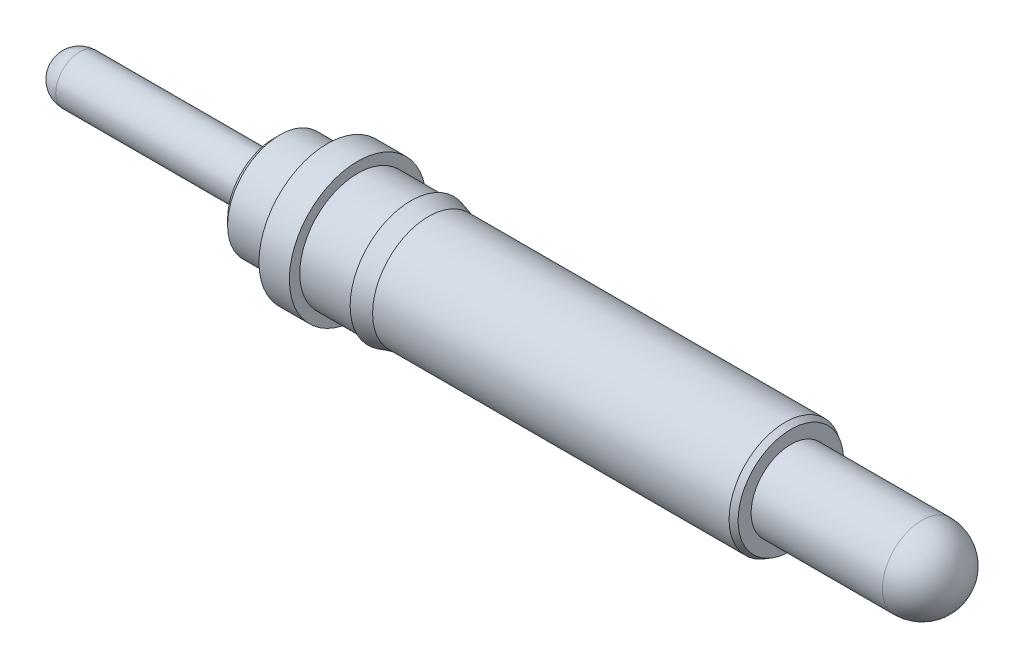
ISO-10303-21;
HEADER;
FILE_DESCRIPTION(('STEP AP214'),'2;1');
FILE_NAME('part.step','',(''),(''),'','','');
FILE_SCHEMA(('AUTOMOTIVE_DESIGN { 1 0 10303 214 1 1 1 1 }'));
ENDSEC;
DATA;
#1=APPLICATION_CONTEXT('core data for automotive mechanical design processes');
#2=APPLICATION_PROTOCOL_DEFINITION('international standard','automotive_design',2000,#1);
#3=PRODUCT_CONTEXT('',#1,'mechanical');
#4=PRODUCT('Part','Part','',(#3));
#5=PRODUCT_RELATED_PRODUCT_CATEGORY('part','',(#4));
#6=PRODUCT_DEFINITION_FORMATION('','',#4);
#7=PRODUCT_DEFINITION_CONTEXT('part definition',#1,'design');
#8=PRODUCT_DEFINITION('design','',#6,#7);
#9=PRODUCT_DEFINITION_SHAPE('','',#8);
#10=(LENGTH_UNIT() NAMED_UNIT(*) SI_UNIT(.MILLI.,.METRE.));
#11=(NAMED_UNIT(*) PLANE_ANGLE_UNIT() SI_UNIT($,.RADIAN.));
#12=(NAMED_UNIT(*) SI_UNIT($,.STERADIAN.) SOLID_ANGLE_UNIT());
#13=UNCERTAINTY_MEASURE_WITH_UNIT(LENGTH_MEASURE(1.E-05),#10,'distance_accuracy_value','');
#14=(GEOMETRIC_REPRESENTATION_CONTEXT(3) GLOBAL_UNCERTAINTY_ASSIGNED_CONTEXT((#13)) GLOBAL_UNIT_ASSIGNED_CONTEXT((#10,
#11,#12)) REPRESENTATION_CONTEXT('',''));
#15=CARTESIAN_POINT('',(0.,0.,0.));
#16=DIRECTION('',(0.,0.,1.));
#17=DIRECTION('',(1.,0.,0.));
#18=AXIS2_PLACEMENT_3D('',#15,#16,#17);
#19=CARTESIAN_POINT('',(0.317499999999853,1.69894480428479E-13,0.));
#20=DIRECTION('',(-1.,0.,0.));
#21=DIRECTION('',(0.,1.,0.));
#22=AXIS2_PLACEMENT_3D('',#19,#20,#21);
#23=SPHERICAL_SURFACE('',#22,0.317499999999853);
#24=CARTESIAN_POINT('',(0.317499999999853,0.,0.));
#25=DIRECTION('',(-1.,0.,0.));
#26=DIRECTION('',(0.,0.,1.));
#27=AXIS2_PLACEMENT_3D('',#24,#25,#26);
#28=CIRCLE('',#27,0.317500000000023);
#29=CARTESIAN_POINT('',(0.317499999999853,0.,0.317500000000023));
#30=VERTEX_POINT('',#29);
#31=EDGE_CURVE('E82',#30,#30,#28,.T.);
#32=ORIENTED_EDGE('',*,*,#31,.T.);
#33=EDGE_LOOP('',(#32));
#34=FACE_BOUND('',#33,.T.);
#35=ADVANCED_FACE('F33',(#34),#23,.T.);
#36=CARTESIAN_POINT('',(11.5849400000002,0.,0.));
#37=DIRECTION('',(-1.,0.,0.));
#38=DIRECTION('',(0.,1.,0.));
#39=AXIS2_PLACEMENT_3D('',#36,#37,#38);
#40=SPHERICAL_SURFACE('',#39,0.530859999999887);
#41=CARTESIAN_POINT('',(11.5849400000002,0.,0.));
#42=DIRECTION('',(-1.,0.,0.));
#43=DIRECTION('',(0.,0.,1.));
#44=AXIS2_PLACEMENT_3D('',#41,#42,#43);
#45=CIRCLE('',#44,0.530859999999887);
#46=CARTESIAN_POINT('',(11.5849400000002,0.,0.530859999999887));
#47=VERTEX_POINT('',#46);
#48=EDGE_CURVE('E10',#47,#47,#45,.T.);
#49=ORIENTED_EDGE('',*,*,#48,.F.);
#50=EDGE_LOOP('',(#49));
#51=FACE_BOUND('',#50,.T.);
#52=ADVANCED_FACE('F166',(#51),#40,.T.);
#53=CARTESIAN_POINT('',(0.,0.,0.));
#54=DIRECTION('',(-1.,0.,0.));
#55=DIRECTION('',(0.,0.,1.));
#56=AXIS2_PLACEMENT_3D('',#53,#54,#55);
#57=CYLINDRICAL_SURFACE('',#56,0.530859999999887);
#58=CARTESIAN_POINT('',(9.8298000000001,0.,0.));
#59=DIRECTION('',(-1.,0.,0.));
#60=DIRECTION('',(0.,0.,1.));
#61=AXIS2_PLACEMENT_3D('',#58,#59,#60);
#62=CIRCLE('',#61,0.530859999999887);
#63=CARTESIAN_POINT('',(9.8298000000001,0.,0.530859999999887));
#64=VERTEX_POINT('',#63);
#65=EDGE_CURVE('E39',#64,#64,#62,.T.);
#66=ORIENTED_EDGE('',*,*,#65,.F.);
#67=EDGE_LOOP('',(#66));
#68=FACE_BOUND('',#67,.T.);
#69=ORIENTED_EDGE('',*,*,#48,.T.);
#70=EDGE_LOOP('',(#69));
#71=FACE_BOUND('',#70,.T.);
#72=ADVANCED_FACE('F161',(#68,#71),#57,.T.);
#73=CARTESIAN_POINT('',(9.8298000000001,0.705305909487751,0.));
#74=DIRECTION('',(-1.,0.,0.));
#75=DIRECTION('',(0.,0.,1.));
#76=AXIS2_PLACEMENT_3D('',#73,#74,#75);
#77=PLANE('',#76);
#78=CARTESIAN_POINT('',(9.8298000000001,0.,0.));
#79=DIRECTION('',(-1.,0.,0.));
#80=DIRECTION('',(0.,0.,1.));
#81=AXIS2_PLACEMENT_3D('',#78,#79,#80);
#82=CIRCLE('',#81,0.705305909487751);
#83=CARTESIAN_POINT('',(9.8298000000001,0.,0.705305909487751));
#84=VERTEX_POINT('',#83);
#85=EDGE_CURVE('E43',#84,#84,#82,.T.);
#86=ORIENTED_EDGE('',*,*,#85,.F.);
#87=EDGE_LOOP('',(#86));
#88=FACE_BOUND('',#87,.T.);
#89=ORIENTED_EDGE('',*,*,#65,.T.);
#90=EDGE_LOOP('',(#89));
#91=FACE_BOUND('',#90,.T.);
#92=ADVANCED_FACE('F156',(#88,#91),#77,.F.);
#93=CARTESIAN_POINT('',(9.8298000000001,0.,0.));
#94=DIRECTION('',(-1.,0.,0.));
#95=DIRECTION('',(0.,0.,1.));
#96=AXIS2_PLACEMENT_3D('',#93,#94,#95);
#97=CONICAL_SURFACE('',#96,0.705305909487751,0.523598775598372);
#98=CARTESIAN_POINT('',(9.75360000000005,0.,0.));
#99=DIRECTION('',(-1.,0.,0.));
#100=DIRECTION('',(0.,0.,1.));
#101=AXIS2_PLACEMENT_3D('',#98,#99,#100);
#102=CIRCLE('',#101,0.749300000000036);
#103=CARTESIAN_POINT('',(9.75360000000005,0.,0.749300000000036));
#104=VERTEX_POINT('',#103);
#105=EDGE_CURVE('E47',#104,#104,#102,.T.);
#106=ORIENTED_EDGE('',*,*,#105,.F.);
#107=EDGE_LOOP('',(#106));
#108=FACE_BOUND('',#107,.T.);
#109=ORIENTED_EDGE('',*,*,#85,.T.);
#110=EDGE_LOOP('',(#109));
#111=FACE_BOUND('',#110,.T.);
#112=ADVANCED_FACE('F150',(#108,#111),#97,.T.);
#113=CARTESIAN_POINT('',(0.,0.,0.));
#114=DIRECTION('',(-1.,0.,0.));
#115=DIRECTION('',(0.,0.,1.));
#116=AXIS2_PLACEMENT_3D('',#113,#114,#115);
#117=CYLINDRICAL_SURFACE('',#116,0.749300000000036);
#118=CARTESIAN_POINT('',(4.98678522628056,0.,0.));
#119=DIRECTION('',(-1.,0.,0.));
#120=DIRECTION('',(0.,0.,1.));
#121=AXIS2_PLACEMENT_3D('',#118,#119,#120);
#122=CIRCLE('',#121,0.749300000000036);
#123=CARTESIAN_POINT('',(4.98678522628056,0.,0.749300000000036));
#124=VERTEX_POINT('',#123);
#125=EDGE_CURVE('E52',#124,#124,#122,.T.);
#126=ORIENTED_EDGE('',*,*,#125,.F.);
#127=EDGE_LOOP('',(#126));
#128=FACE_BOUND('',#127,.T.);
#129=ORIENTED_EDGE('',*,*,#105,.T.);
#130=EDGE_LOOP('',(#129));
#131=FACE_BOUND('',#130,.T.);
#132=ADVANCED_FACE('F144',(#128,#131),#117,.T.);
#133=CARTESIAN_POINT('',(4.98678522628056,0.,0.));
#134=DIRECTION('',(-1.,0.,0.));
#135=DIRECTION('',(0.,0.,1.));
#136=AXIS2_PLACEMENT_3D('',#133,#134,#135);
#137=CONICAL_SURFACE('',#136,0.749300000000036,0.261799387799377);
#138=CARTESIAN_POINT('',(4.74980000000002,0.,0.));
#139=DIRECTION('',(-1.,0.,0.));
#140=DIRECTION('',(0.,0.,1.));
#141=AXIS2_PLACEMENT_3D('',#138,#139,#140);
#142=CIRCLE('',#141,0.812800000000071);
#143=CARTESIAN_POINT('',(4.74980000000002,0.,0.812800000000071));
#144=VERTEX_POINT('',#143);
#145=EDGE_CURVE('E55',#144,#144,#142,.T.);
#146=ORIENTED_EDGE('',*,*,#145,.F.);
#147=EDGE_LOOP('',(#146));
#148=FACE_BOUND('',#147,.T.);
#149=ORIENTED_EDGE('',*,*,#125,.T.);
#150=EDGE_LOOP('',(#149));
#151=FACE_BOUND('',#150,.T.);
#152=ADVANCED_FACE('F138',(#148,#151),#137,.T.);
#153=CARTESIAN_POINT('',(4.74980000000002,0.774700000000045,0.));
#154=DIRECTION('',(1.,0.,0.));
#155=DIRECTION('',(0.,0.,-1.));
#156=AXIS2_PLACEMENT_3D('',#153,#154,#155);
#157=PLANE('',#156);
#158=CARTESIAN_POINT('',(4.74980000000002,0.,0.));
#159=DIRECTION('',(-1.,0.,0.));
#160=DIRECTION('',(0.,0.,1.));
#161=AXIS2_PLACEMENT_3D('',#158,#159,#160);
#162=CIRCLE('',#161,0.774700000000045);
#163=CARTESIAN_POINT('',(4.74980000000002,0.,0.774700000000045));
#164=VERTEX_POINT('',#163);
#165=EDGE_CURVE('E58',#164,#164,#162,.T.);
#166=ORIENTED_EDGE('',*,*,#165,.F.);
#167=EDGE_LOOP('',(#166));
#168=FACE_BOUND('',#167,.T.);
#169=ORIENTED_EDGE('',*,*,#145,.T.);
#170=EDGE_LOOP('',(#169));
#171=FACE_BOUND('',#170,.T.);
#172=ADVANCED_FACE('F132',(#168,#171),#157,.F.);
#173=CARTESIAN_POINT('',(0.,0.,0.));
#174=DIRECTION('',(-1.,0.,0.));
#175=DIRECTION('',(0.,0.,1.));
#176=AXIS2_PLACEMENT_3D('',#173,#174,#175);
#177=CYLINDRICAL_SURFACE('',#176,0.774700000000045);
#178=CARTESIAN_POINT('',(4.03860000000005,0.,0.));
#179=DIRECTION('',(-1.,0.,0.));
#180=DIRECTION('',(0.,0.,1.));
#181=AXIS2_PLACEMENT_3D('',#178,#179,#180);
#182=CIRCLE('',#181,0.774700000000045);
#183=CARTESIAN_POINT('',(4.03860000000005,0.,0.774700000000045));
#184=VERTEX_POINT('',#183);
#185=EDGE_CURVE('E61',#184,#184,#182,.T.);
#186=ORIENTED_EDGE('',*,*,#185,.F.);
#187=EDGE_LOOP('',(#186));
#188=FACE_BOUND('',#187,.T.);
#189=ORIENTED_EDGE('',*,*,#165,.T.);
#190=EDGE_LOOP('',(#189));
#191=FACE_BOUND('',#190,.T.);
#192=ADVANCED_FACE('F126',(#188,#191),#177,.T.);
#193=CARTESIAN_POINT('',(4.03860000000005,0.914400000000037,0.));
#194=DIRECTION('',(-1.,0.,0.));
#195=DIRECTION('',(0.,0.,1.));
#196=AXIS2_PLACEMENT_3D('',#193,#194,#195);
#197=PLANE('',#196);
#198=CARTESIAN_POINT('',(4.03860000000005,0.,0.));
#199=DIRECTION('',(-1.,0.,0.));
#200=DIRECTION('',(0.,0.,1.));
#201=AXIS2_PLACEMENT_3D('',#198,#199,#200);
#202=CIRCLE('',#201,0.914400000000037);
#203=CARTESIAN_POINT('',(4.03860000000005,0.,0.914400000000037));
#204=VERTEX_POINT('',#203);
#205=EDGE_CURVE('E64',#204,#204,#202,.T.);
#206=ORIENTED_EDGE('',*,*,#205,.F.);
#207=EDGE_LOOP('',(#206));
#208=FACE_BOUND('',#207,.T.);
#209=ORIENTED_EDGE('',*,*,#185,.T.);
#210=EDGE_LOOP('',(#209));
#211=FACE_BOUND('',#210,.T.);
#212=ADVANCED_FACE('F120',(#208,#211),#197,.F.);
#213=CARTESIAN_POINT('',(0.,0.,0.));
#214=DIRECTION('',(-1.,0.,0.));
#215=DIRECTION('',(0.,0.,1.));
#216=AXIS2_PLACEMENT_3D('',#213,#214,#215);
#217=CYLINDRICAL_SURFACE('',#216,0.914400000000037);
#218=CARTESIAN_POINT('',(3.63220000000005,0.,0.));
#219=DIRECTION('',(-1.,0.,0.));
#220=DIRECTION('',(0.,0.,1.));
#221=AXIS2_PLACEMENT_3D('',#218,#219,#220);
#222=CIRCLE('',#221,0.914400000000037);
#223=CARTESIAN_POINT('',(3.63220000000005,0.,0.914400000000037));
#224=VERTEX_POINT('',#223);
#225=EDGE_CURVE('E67',#224,#224,#222,.T.);
#226=ORIENTED_EDGE('',*,*,#225,.F.);
#227=EDGE_LOOP('',(#226));
#228=FACE_BOUND('',#227,.T.);
#229=ORIENTED_EDGE('',*,*,#205,.T.);
#230=EDGE_LOOP('',(#229));
#231=FACE_BOUND('',#230,.T.);
#232=ADVANCED_FACE('F114',(#228,#231),#217,.T.);
#233=CARTESIAN_POINT('',(3.63220000000005,0.698499999999853,0.));
#234=DIRECTION('',(1.,0.,0.));
#235=DIRECTION('',(0.,0.,-1.));
#236=AXIS2_PLACEMENT_3D('',#233,#234,#235);
#237=PLANE('',#236);
#238=CARTESIAN_POINT('',(3.63220000000005,0.,0.));
#239=DIRECTION('',(-1.,0.,0.));
#240=DIRECTION('',(0.,0.,1.));
#241=AXIS2_PLACEMENT_3D('',#238,#239,#240);
#242=CIRCLE('',#241,0.698499999999853);
#243=CARTESIAN_POINT('',(3.63220000000005,0.,0.698499999999853));
#244=VERTEX_POINT('',#243);
#245=EDGE_CURVE('E70',#244,#244,#242,.T.);
#246=ORIENTED_EDGE('',*,*,#245,.F.);
#247=EDGE_LOOP('',(#246));
#248=FACE_BOUND('',#247,.T.);
#249=ORIENTED_EDGE('',*,*,#225,.T.);
#250=EDGE_LOOP('',(#249));
#251=FACE_BOUND('',#250,.T.);
#252=ADVANCED_FACE('F108',(#248,#251),#237,.F.);
#253=CARTESIAN_POINT('',(0.,0.,0.));
#254=DIRECTION('',(-1.,0.,0.));
#255=DIRECTION('',(0.,0.,1.));
#256=AXIS2_PLACEMENT_3D('',#253,#254,#255);
#257=CYLINDRICAL_SURFACE('',#256,0.698499999999853);
#258=CARTESIAN_POINT('',(2.9971999999999,0.,0.));
#259=DIRECTION('',(-1.,0.,0.));
#260=DIRECTION('',(0.,0.,1.));
#261=AXIS2_PLACEMENT_3D('',#258,#259,#260);
#262=CIRCLE('',#261,0.698499999999853);
#263=CARTESIAN_POINT('',(2.9971999999999,0.,0.698499999999853));
#264=VERTEX_POINT('',#263);
#265=EDGE_CURVE('E73',#264,#264,#262,.T.);
#266=ORIENTED_EDGE('',*,*,#265,.F.);
#267=EDGE_LOOP('',(#266));
#268=FACE_BOUND('',#267,.T.);
#269=ORIENTED_EDGE('',*,*,#245,.T.);
#270=EDGE_LOOP('',(#269));
#271=FACE_BOUND('',#270,.T.);
#272=ADVANCED_FACE('F102',(#268,#271),#257,.T.);
#273=CARTESIAN_POINT('',(2.9971999999999,0.,0.));
#274=DIRECTION('',(1.,0.,0.));
#275=DIRECTION('',(0.,0.,-1.));
#276=AXIS2_PLACEMENT_3D('',#273,#274,#275);
#277=CONICAL_SURFACE('',#276,0.698499999999853,0.785398163397985);
#278=CARTESIAN_POINT('',(2.9210000000001,0.,0.));
#279=DIRECTION('',(-1.,0.,0.));
#280=DIRECTION('',(0.,0.,1.));
#281=AXIS2_PLACEMENT_3D('',#278,#279,#280);
#282=CIRCLE('',#281,0.622299999999966);
#283=CARTESIAN_POINT('',(2.9210000000001,0.,0.622299999999966));
#284=VERTEX_POINT('',#283);
#285=EDGE_CURVE('E76',#284,#284,#282,.T.);
#286=ORIENTED_EDGE('',*,*,#285,.F.);
#287=EDGE_LOOP('',(#286));
#288=FACE_BOUND('',#287,.T.);
#289=ORIENTED_EDGE('',*,*,#265,.T.);
#290=EDGE_LOOP('',(#289));
#291=FACE_BOUND('',#290,.T.);
#292=ADVANCED_FACE('F96',(#288,#291),#277,.T.);
#293=CARTESIAN_POINT('',(2.9210000000001,0.317500000000023,0.));
#294=DIRECTION('',(1.,0.,0.));
#295=DIRECTION('',(0.,0.,-1.));
#296=AXIS2_PLACEMENT_3D('',#293,#294,#295);
#297=PLANE('',#296);
#298=CARTESIAN_POINT('',(2.9210000000001,0.,0.));
#299=DIRECTION('',(-1.,0.,0.));
#300=DIRECTION('',(0.,0.,1.));
#301=AXIS2_PLACEMENT_3D('',#298,#299,#300);
#302=CIRCLE('',#301,0.317500000000023);
#303=CARTESIAN_POINT('',(2.9210000000001,0.,0.317500000000023));
#304=VERTEX_POINT('',#303);
#305=EDGE_CURVE('E79',#304,#304,#302,.T.);
#306=ORIENTED_EDGE('',*,*,#305,.F.);
#307=EDGE_LOOP('',(#306));
#308=FACE_BOUND('',#307,.T.);
#309=ORIENTED_EDGE('',*,*,#285,.T.);
#310=EDGE_LOOP('',(#309));
#311=FACE_BOUND('',#310,.T.);
#312=ADVANCED_FACE('F90',(#308,#311),#297,.F.);
#313=CARTESIAN_POINT('',(0.,0.,0.));
#314=DIRECTION('',(-1.,0.,0.));
#315=DIRECTION('',(0.,0.,1.));
#316=AXIS2_PLACEMENT_3D('',#313,#314,#315);
#317=CYLINDRICAL_SURFACE('',#316,0.317500000000023);
#318=ORIENTED_EDGE('',*,*,#31,.F.);
#319=EDGE_LOOP('',(#318));
#320=FACE_BOUND('',#319,.T.);
#321=ORIENTED_EDGE('',*,*,#305,.T.);
#322=EDGE_LOOP('',(#321));
#323=FACE_BOUND('',#322,.T.);
#324=ADVANCED_FACE('F87',(#320,#323),#317,.T.);
#325=CLOSED_SHELL('',(#35,#52,#72,#92,#112,#132,#152,#172,#192,#212,#232,#252,#272,#292,#312,#324));
#326=MANIFOLD_SOLID_BREP('B2',#325);
#327=ADVANCED_BREP_SHAPE_REPRESENTATION('',(#18,#326),#14);
#328=SHAPE_DEFINITION_REPRESENTATION(#9,#327);
ENDSEC;
END-ISO-10303-21;
